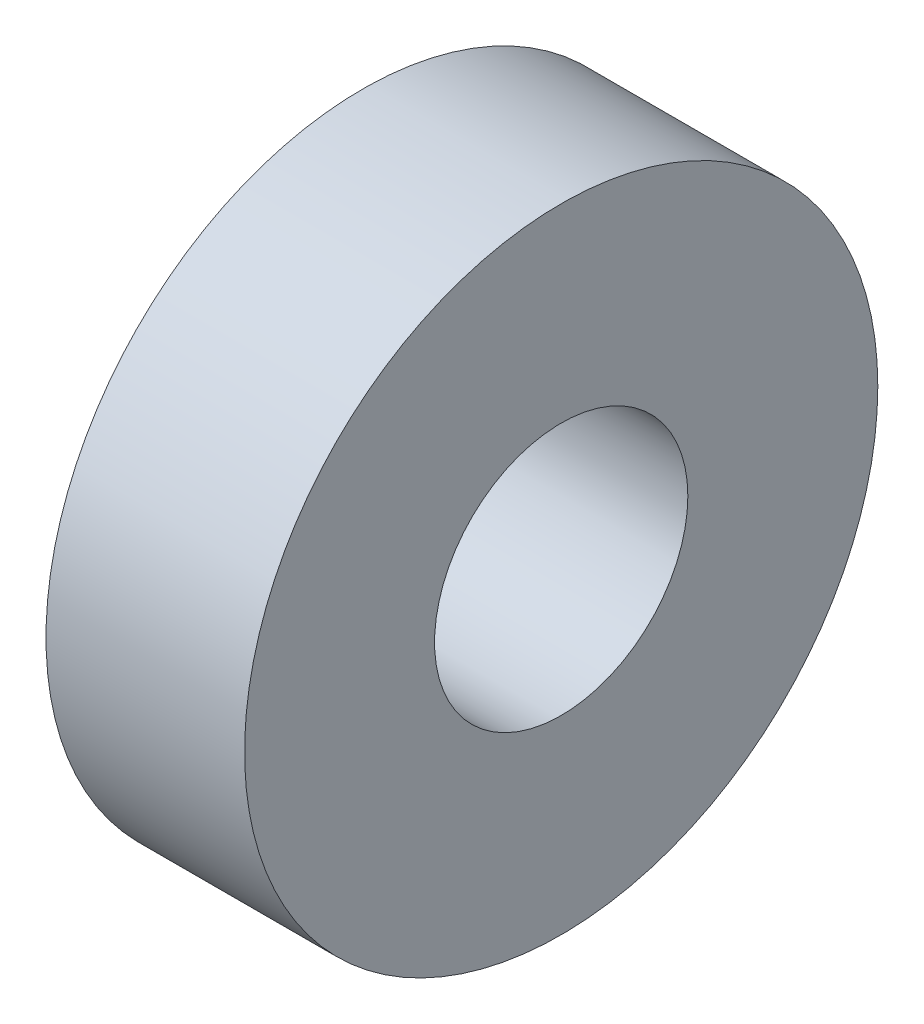
ISO-10303-21;
HEADER;
FILE_DESCRIPTION(('STEP AP214'),'2;1');
FILE_NAME('part.step','',(''),(''),'','','');
FILE_SCHEMA(('AUTOMOTIVE_DESIGN { 1 0 10303 214 1 1 1 1 }'));
ENDSEC;
DATA;
#1=APPLICATION_CONTEXT('core data for automotive mechanical design processes');
#2=APPLICATION_PROTOCOL_DEFINITION('international standard','automotive_design',2000,#1);
#3=PRODUCT_CONTEXT('',#1,'mechanical');
#4=PRODUCT('Part','Part','',(#3));
#5=PRODUCT_RELATED_PRODUCT_CATEGORY('part','',(#4));
#6=PRODUCT_DEFINITION_FORMATION('','',#4);
#7=PRODUCT_DEFINITION_CONTEXT('part definition',#1,'design');
#8=PRODUCT_DEFINITION('design','',#6,#7);
#9=PRODUCT_DEFINITION_SHAPE('','',#8);
#10=(LENGTH_UNIT() NAMED_UNIT(*) SI_UNIT(.MILLI.,.METRE.));
#11=(NAMED_UNIT(*) PLANE_ANGLE_UNIT() SI_UNIT($,.RADIAN.));
#12=(NAMED_UNIT(*) SI_UNIT($,.STERADIAN.) SOLID_ANGLE_UNIT());
#13=UNCERTAINTY_MEASURE_WITH_UNIT(LENGTH_MEASURE(1.E-05),#10,'distance_accuracy_value','');
#14=(GEOMETRIC_REPRESENTATION_CONTEXT(3) GLOBAL_UNCERTAINTY_ASSIGNED_CONTEXT((#13)) GLOBAL_UNIT_ASSIGNED_CONTEXT((#10,
#11,#12)) REPRESENTATION_CONTEXT('',''));
#15=CARTESIAN_POINT('',(0.,0.,0.));
#16=DIRECTION('',(0.,0.,1.));
#17=DIRECTION('',(1.,0.,0.));
#18=AXIS2_PLACEMENT_3D('',#15,#16,#17);
#19=CARTESIAN_POINT('',(2.4892,0.,0.));
#20=DIRECTION('',(1.,0.,0.));
#21=DIRECTION('',(0.,0.,-1.));
#22=AXIS2_PLACEMENT_3D('',#19,#20,#21);
#23=PLANE('',#22);
#24=CARTESIAN_POINT('',(2.4892,0.,0.));
#25=DIRECTION('',(1.,0.,0.));
#26=DIRECTION('',(0.,0.,-1.));
#27=AXIS2_PLACEMENT_3D('',#24,#25,#26);
#28=CIRCLE('',#27,7.9375);
#29=CARTESIAN_POINT('',(2.4892,0.,-7.9375));
#30=VERTEX_POINT('',#29);
#31=EDGE_CURVE('E10',#30,#30,#28,.T.);
#32=ORIENTED_EDGE('',*,*,#31,.T.);
#33=EDGE_LOOP('',(#32));
#34=FACE_BOUND('',#33,.T.);
#35=CARTESIAN_POINT('',(2.4892,0.,0.));
#36=DIRECTION('',(1.,0.,0.));
#37=DIRECTION('',(0.,0.,-1.));
#38=AXIS2_PLACEMENT_3D('',#35,#36,#37);
#39=CIRCLE('',#38,3.175);
#40=CARTESIAN_POINT('',(2.4892,0.,-3.175));
#41=VERTEX_POINT('',#40);
#42=EDGE_CURVE('E54',#41,#41,#39,.T.);
#43=ORIENTED_EDGE('',*,*,#42,.F.);
#44=EDGE_LOOP('',(#43));
#45=FACE_BOUND('',#44,.T.);
#46=ADVANCED_FACE('F43',(#34,#45),#23,.T.);
#47=CARTESIAN_POINT('',(-2.4892,0.,0.));
#48=DIRECTION('',(1.,0.,0.));
#49=DIRECTION('',(0.,0.,-1.));
#50=AXIS2_PLACEMENT_3D('',#47,#48,#49);
#51=PLANE('',#50);
#52=CARTESIAN_POINT('',(-2.4892,0.,0.));
#53=DIRECTION('',(1.,0.,0.));
#54=DIRECTION('',(0.,0.,-1.));
#55=AXIS2_PLACEMENT_3D('',#52,#53,#54);
#56=CIRCLE('',#55,7.9375);
#57=CARTESIAN_POINT('',(-2.4892,0.,-7.9375));
#58=VERTEX_POINT('',#57);
#59=EDGE_CURVE('E47',#58,#58,#56,.T.);
#60=ORIENTED_EDGE('',*,*,#59,.F.);
#61=EDGE_LOOP('',(#60));
#62=FACE_BOUND('',#61,.T.);
#63=CARTESIAN_POINT('',(-2.4892,0.,0.));
#64=DIRECTION('',(1.,0.,0.));
#65=DIRECTION('',(0.,0.,-1.));
#66=AXIS2_PLACEMENT_3D('',#63,#64,#65);
#67=CIRCLE('',#66,3.175);
#68=CARTESIAN_POINT('',(-2.4892,0.,-3.175));
#69=VERTEX_POINT('',#68);
#70=EDGE_CURVE('E56',#69,#69,#67,.T.);
#71=ORIENTED_EDGE('',*,*,#70,.T.);
#72=EDGE_LOOP('',(#71));
#73=FACE_BOUND('',#72,.T.);
#74=ADVANCED_FACE('F66',(#62,#73),#51,.F.);
#75=CARTESIAN_POINT('',(2.4892,0.,0.));
#76=DIRECTION('',(-1.,0.,0.));
#77=DIRECTION('',(0.,0.,1.));
#78=AXIS2_PLACEMENT_3D('',#75,#76,#77);
#79=CYLINDRICAL_SURFACE('',#78,7.9375);
#80=ORIENTED_EDGE('',*,*,#31,.F.);
#81=EDGE_LOOP('',(#80));
#82=FACE_BOUND('',#81,.T.);
#83=ORIENTED_EDGE('',*,*,#59,.T.);
#84=EDGE_LOOP('',(#83));
#85=FACE_BOUND('',#84,.T.);
#86=ADVANCED_FACE('F45',(#82,#85),#79,.T.);
#87=CARTESIAN_POINT('',(2.4892,0.,0.));
#88=DIRECTION('',(-1.,0.,0.));
#89=DIRECTION('',(0.,0.,1.));
#90=AXIS2_PLACEMENT_3D('',#87,#88,#89);
#91=CYLINDRICAL_SURFACE('',#90,3.175);
#92=ORIENTED_EDGE('',*,*,#42,.T.);
#93=EDGE_LOOP('',(#92));
#94=FACE_BOUND('',#93,.T.);
#95=ORIENTED_EDGE('',*,*,#70,.F.);
#96=EDGE_LOOP('',(#95));
#97=FACE_BOUND('',#96,.T.);
#98=ADVANCED_FACE('F62',(#94,#97),#91,.F.);
#99=CLOSED_SHELL('',(#46,#74,#86,#98));
#100=MANIFOLD_SOLID_BREP('B2',#99);
#101=ADVANCED_BREP_SHAPE_REPRESENTATION('',(#18,#100),#14);
#102=SHAPE_DEFINITION_REPRESENTATION(#9,#101);
ENDSEC;
END-ISO-10303-21;
